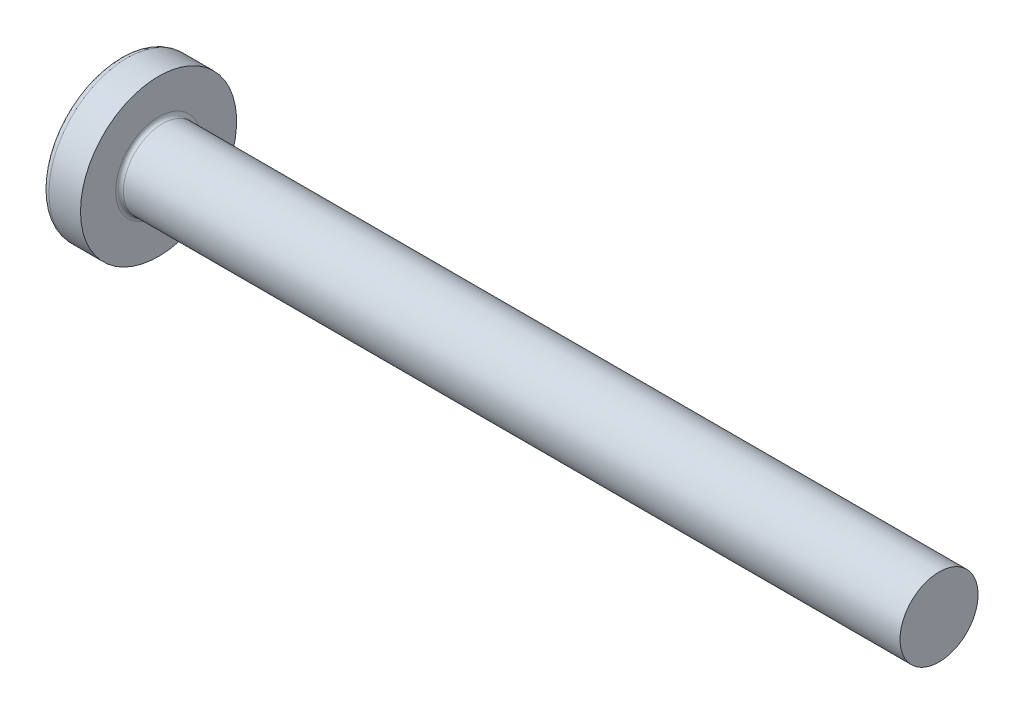
ISO-10303-21;
HEADER;
FILE_DESCRIPTION(('STEP AP214'),'2;1');
FILE_NAME('part.step','',(''),(''),'','','');
FILE_SCHEMA(('AUTOMOTIVE_DESIGN { 1 0 10303 214 1 1 1 1 }'));
ENDSEC;
DATA;
#1=APPLICATION_CONTEXT('core data for automotive mechanical design processes');
#2=APPLICATION_PROTOCOL_DEFINITION('international standard','automotive_design',2000,#1);
#3=PRODUCT_CONTEXT('',#1,'mechanical');
#4=PRODUCT('Part','Part','',(#3));
#5=PRODUCT_RELATED_PRODUCT_CATEGORY('part','',(#4));
#6=PRODUCT_DEFINITION_FORMATION('','',#4);
#7=PRODUCT_DEFINITION_CONTEXT('part definition',#1,'design');
#8=PRODUCT_DEFINITION('design','',#6,#7);
#9=PRODUCT_DEFINITION_SHAPE('','',#8);
#10=(LENGTH_UNIT() NAMED_UNIT(*) SI_UNIT(.MILLI.,.METRE.));
#11=(NAMED_UNIT(*) PLANE_ANGLE_UNIT() SI_UNIT($,.RADIAN.));
#12=(NAMED_UNIT(*) SI_UNIT($,.STERADIAN.) SOLID_ANGLE_UNIT());
#13=UNCERTAINTY_MEASURE_WITH_UNIT(LENGTH_MEASURE(1.E-05),#10,'distance_accuracy_value','');
#14=(GEOMETRIC_REPRESENTATION_CONTEXT(3) GLOBAL_UNCERTAINTY_ASSIGNED_CONTEXT((#13)) GLOBAL_UNIT_ASSIGNED_CONTEXT((#10,
#11,#12)) REPRESENTATION_CONTEXT('',''));
#15=CARTESIAN_POINT('',(0.,0.,0.));
#16=DIRECTION('',(0.,0.,1.));
#17=DIRECTION('',(1.,0.,0.));
#18=AXIS2_PLACEMENT_3D('',#15,#16,#17);
#19=CARTESIAN_POINT('',(3.2,0.,0.));
#20=DIRECTION('',(-1.,0.,0.));
#21=DIRECTION('',(0.,1.,0.));
#22=AXIS2_PLACEMENT_3D('',#19,#20,#21);
#23=SPHERICAL_SURFACE('',#22,3.2);
#24=CARTESIAN_POINT('',(0.646379599446113,0.,0.));
#25=DIRECTION('',(-1.,0.,0.));
#26=DIRECTION('',(0.,0.,1.));
#27=AXIS2_PLACEMENT_3D('',#24,#25,#26);
#28=CIRCLE('',#27,1.92847682119205);
#29=CARTESIAN_POINT('',(0.646379599446113,0.,1.92847682119205));
#30=VERTEX_POINT('',#29);
#31=EDGE_CURVE('E237',#30,#30,#28,.T.);
#32=ORIENTED_EDGE('',*,*,#31,.T.);
#33=EDGE_LOOP('',(#32));
#34=FACE_BOUND('',#33,.T.);
#35=CARTESIAN_POINT('',(0.0321614467928854,0.,0.));
#36=DIRECTION('',(1.,0.,0.));
#37=DIRECTION('',(0.,0.,-1.));
#38=AXIS2_PLACEMENT_3D('',#35,#36,#37);
#39=CIRCLE('',#38,0.452547125518057);
#40=CARTESIAN_POINT('',(0.0321614467928861,-0.239999999999998,-0.38366508938742));
#41=VERTEX_POINT('',#40);
#42=CARTESIAN_POINT('',(0.0321614467928854,-0.383665089387419,-0.24));
#43=VERTEX_POINT('',#42);
#44=EDGE_CURVE('E373',#41,#43,#39,.F.);
#45=ORIENTED_EDGE('',*,*,#44,.F.);
#46=CARTESIAN_POINT('',(3.2,-0.24,0.));
#47=DIRECTION('',(0.,1.,0.));
#48=DIRECTION('',(0.,0.,1.));
#49=AXIS2_PLACEMENT_3D('',#46,#47,#48);
#50=CIRCLE('',#49,3.19098730802866);
#51=CARTESIAN_POINT('',(0.160076673366103,-0.239999999999996,-0.970188728128244));
#52=VERTEX_POINT('',#51);
#53=EDGE_CURVE('E299',#52,#41,#50,.T.);
#54=ORIENTED_EDGE('',*,*,#53,.F.);
#55=CARTESIAN_POINT('',(2.98218780828175,0.,0.436863744320002));
#56=DIRECTION('',(0.446197753347436,0.,-0.894934391398443));
#57=DIRECTION('',(-0.894934391398442,0.,-0.446197753347436));
#58=AXIS2_PLACEMENT_3D('',#55,#56,#57);
#59=CIRCLE('',#58,3.16254769419176);
#60=CARTESIAN_POINT('',(0.160076673366103,0.240000000000003,-0.970188728128242));
#61=VERTEX_POINT('',#60);
#62=EDGE_CURVE('E271',#52,#61,#59,.T.);
#63=ORIENTED_EDGE('',*,*,#62,.T.);
#64=CARTESIAN_POINT('',(3.2,0.24,0.));
#65=DIRECTION('',(0.,-1.,0.));
#66=DIRECTION('',(0.,0.,-1.));
#67=AXIS2_PLACEMENT_3D('',#64,#65,#66);
#68=CIRCLE('',#67,3.19098730802866);
#69=CARTESIAN_POINT('',(0.0321614467928856,0.240000000000001,-0.383665089387418));
#70=VERTEX_POINT('',#69);
#71=EDGE_CURVE('E326',#70,#61,#68,.T.);
#72=ORIENTED_EDGE('',*,*,#71,.F.);
#73=CARTESIAN_POINT('',(0.0321614467928854,0.383665089387417,-0.24));
#74=VERTEX_POINT('',#73);
#75=EDGE_CURVE('E392',#74,#70,#39,.F.);
#76=ORIENTED_EDGE('',*,*,#75,.F.);
#77=CARTESIAN_POINT('',(3.2,0.,-0.24));
#78=DIRECTION('',(0.,0.,1.));
#79=DIRECTION('',(1.,0.,0.));
#80=AXIS2_PLACEMENT_3D('',#77,#78,#79);
#81=CIRCLE('',#80,3.19098730802866);
#82=CARTESIAN_POINT('',(0.160076673366104,0.970188728128243,-0.24));
#83=VERTEX_POINT('',#82);
#84=EDGE_CURVE('E265',#83,#74,#81,.T.);
#85=ORIENTED_EDGE('',*,*,#84,.F.);
#86=CARTESIAN_POINT('',(2.98218780828175,-0.436863744320003,0.));
#87=DIRECTION('',(0.446197753347436,0.894934391398443,0.));
#88=DIRECTION('',(-0.894934391398443,0.446197753347436,0.));
#89=AXIS2_PLACEMENT_3D('',#86,#87,#88);
#90=CIRCLE('',#89,3.16254769419176);
#91=CARTESIAN_POINT('',(0.160076673366104,0.970188728128243,0.24));
#92=VERTEX_POINT('',#91);
#93=EDGE_CURVE('E268',#83,#92,#90,.T.);
#94=ORIENTED_EDGE('',*,*,#93,.T.);
#95=CARTESIAN_POINT('',(3.2,0.,0.24));
#96=DIRECTION('',(0.,0.,-1.));
#97=DIRECTION('',(0.,1.,0.));
#98=AXIS2_PLACEMENT_3D('',#95,#96,#97);
#99=CIRCLE('',#98,3.19098730802866);
#100=CARTESIAN_POINT('',(0.0321614467928856,0.383665089387416,0.24));
#101=VERTEX_POINT('',#100);
#102=EDGE_CURVE('E261',#101,#92,#99,.T.);
#103=ORIENTED_EDGE('',*,*,#102,.F.);
#104=CARTESIAN_POINT('',(0.0321614467928855,0.239999999999999,0.38366508938742));
#105=VERTEX_POINT('',#104);
#106=EDGE_CURVE('E391',#105,#101,#39,.F.);
#107=ORIENTED_EDGE('',*,*,#106,.F.);
#108=CARTESIAN_POINT('',(0.160076673366103,0.239999999999997,0.970188728128244));
#109=VERTEX_POINT('',#108);
#110=EDGE_CURVE('E281',#109,#105,#68,.T.);
#111=ORIENTED_EDGE('',*,*,#110,.F.);
#112=CARTESIAN_POINT('',(2.98218780828175,0.,-0.436863744320003));
#113=DIRECTION('',(0.446197753347436,0.,0.894934391398443));
#114=DIRECTION('',(0.894934391398443,0.,-0.446197753347436));
#115=AXIS2_PLACEMENT_3D('',#112,#113,#114);
#116=CIRCLE('',#115,3.16254769419176);
#117=CARTESIAN_POINT('',(0.160076673366103,-0.240000000000003,0.970188728128242));
#118=VERTEX_POINT('',#117);
#119=EDGE_CURVE('E48',#109,#118,#116,.T.);
#120=ORIENTED_EDGE('',*,*,#119,.T.);
#121=CARTESIAN_POINT('',(0.0321614467928861,-0.240000000000001,0.383665089387418));
#122=VERTEX_POINT('',#121);
#123=EDGE_CURVE('E278',#122,#118,#50,.T.);
#124=ORIENTED_EDGE('',*,*,#123,.F.);
#125=CARTESIAN_POINT('',(0.0321614467928856,-0.383665089387418,0.24));
#126=VERTEX_POINT('',#125);
#127=EDGE_CURVE('E427',#126,#122,#39,.F.);
#128=ORIENTED_EDGE('',*,*,#127,.F.);
#129=CARTESIAN_POINT('',(0.160076673366103,-0.970188728128243,0.24));
#130=VERTEX_POINT('',#129);
#131=EDGE_CURVE('E262',#130,#126,#99,.T.);
#132=ORIENTED_EDGE('',*,*,#131,.F.);
#133=CARTESIAN_POINT('',(2.98218780828175,0.436863744320002,0.));
#134=DIRECTION('',(0.446197753347436,-0.894934391398443,0.));
#135=DIRECTION('',(0.894934391398442,0.446197753347436,0.));
#136=AXIS2_PLACEMENT_3D('',#133,#134,#135);
#137=CIRCLE('',#136,3.16254769419176);
#138=CARTESIAN_POINT('',(0.160076673366103,-0.970188728128243,-0.24));
#139=VERTEX_POINT('',#138);
#140=EDGE_CURVE('E258',#130,#139,#137,.T.);
#141=ORIENTED_EDGE('',*,*,#140,.T.);
#142=EDGE_CURVE('E63',#43,#139,#81,.T.);
#143=ORIENTED_EDGE('',*,*,#142,.F.);
#144=EDGE_LOOP('',(#45,#54,#63,#72,#76,#85,#94,#103,#107,#111,#120,#124,#128,#132,#141,#143));
#145=FACE_BOUND('',#144,.T.);
#146=ADVANCED_FACE('F35',(#34,#145),#23,.T.);
#147=CARTESIAN_POINT('',(1.42,0.342014234961647,-0.24));
#148=DIRECTION('',(0.,0.,1.));
#149=DIRECTION('',(1.,0.,0.));
#150=AXIS2_PLACEMENT_3D('',#147,#148,#149);
#151=PLANE('',#150);
#152=ORIENTED_EDGE('',*,*,#84,.T.);
#153=CARTESIAN_POINT('',(-0.626811087646333,0.437068483432734,-0.24));
#154=CARTESIAN_POINT('',(-0.489788496188268,0.426133650699674,-0.24));
#155=CARTESIAN_POINT('',(-0.35277275089666,0.415111501640761,-0.24));
#156=CARTESIAN_POINT('',(-0.078757882964478,0.392826208775377,-0.24));
#157=CARTESIAN_POINT('',(0.0582412392502161,0.381563059737591,-0.24));
#158=CARTESIAN_POINT('',(0.332213907654152,0.358729879929546,-0.24));
#159=CARTESIAN_POINT('',(0.469187453856035,0.347159849311357,-0.24));
#160=CARTESIAN_POINT('',(0.743097225439297,0.323608060039765,-0.24));
#161=CARTESIAN_POINT('',(0.880033451350377,0.311626307573655,-0.24));
#162=CARTESIAN_POINT('',(1.12503843743479,0.289667437089413,-0.24));
#163=CARTESIAN_POINT('',(1.23311691792,0.279799173776849,-0.24));
#164=CARTESIAN_POINT('',(1.4492267018282,0.259570129968442,-0.24));
#165=CARTESIAN_POINT('',(1.55725800577256,0.249209355061897,-0.24));
#166=CARTESIAN_POINT('',(1.77325939831777,0.227783788850472,-0.24));
#167=CARTESIAN_POINT('',(1.88122948205844,0.216718947894399,-0.24));
#168=CARTESIAN_POINT('',(2.04309848476113,0.199296215271932,-0.24));
#169=CARTESIAN_POINT('',(2.09704158415864,0.193350927204474,-0.24));
#170=CARTESIAN_POINT('',(2.20488609252136,0.181086542764125,-0.24));
#171=CARTESIAN_POINT('',(2.25878750075649,0.174767439988846,-0.24));
#172=CARTESIAN_POINT('',(2.31266102213859,0.168212174791089,-0.24));
#173=B_SPLINE_CURVE_WITH_KNOTS('',3,(#153,#154,#155,#156,#157,#158,#159,#160,#161,#162,#163,
#164,#165,#166,#167,#168,#169,#170,#171,#172),.UNSPECIFIED.,.F.,.F.,(4,2,2,2,2,2,2,2,2,4),(0.,
0.412374804430943,0.824758569256476,1.23714212973639,1.64951949568622,1.97510284899868,
2.30068250829037,2.62628515317116,2.78909323564388,2.95190410736571),.UNSPECIFIED.);
#174=CARTESIAN_POINT('',(1.42,0.262259890185288,-0.240000000000001));
#175=VERTEX_POINT('',#174);
#176=EDGE_CURVE('E413',#74,#175,#173,.T.);
#177=ORIENTED_EDGE('',*,*,#176,.T.);
#178=DIRECTION('',(0.,1.,0.));
#179=VECTOR('',#178,1.);
#180=CARTESIAN_POINT('',(1.42,-0.342014234961648,-0.24));
#181=LINE('',#180,#179);
#182=CARTESIAN_POINT('',(1.42,0.342014234961647,-0.24));
#183=VERTEX_POINT('',#182);
#184=EDGE_CURVE('E355',#175,#183,#181,.T.);
#185=ORIENTED_EDGE('',*,*,#184,.T.);
#186=DIRECTION('',(0.894934391398442,-0.446197753347436,0.));
#187=VECTOR('',#186,1.);
#188=CARTESIAN_POINT('',(0.,1.05,-0.24));
#189=LINE('',#188,#187);
#190=EDGE_CURVE('E238',#83,#183,#189,.T.);
#191=ORIENTED_EDGE('',*,*,#190,.F.);
#192=EDGE_LOOP('',(#152,#177,#185,#191));
#193=FACE_BOUND('',#192,.T.);
#194=ADVANCED_FACE('F193',(#193),#151,.T.);
#195=CARTESIAN_POINT('',(1.42,-0.342014234961648,-0.24));
#196=VERTEX_POINT('',#195);
#197=CARTESIAN_POINT('',(1.42,-0.262259890185288,-0.240000000000001));
#198=VERTEX_POINT('',#197);
#199=EDGE_CURVE('E246',#196,#198,#181,.T.);
#200=ORIENTED_EDGE('',*,*,#199,.T.);
#201=CARTESIAN_POINT('',(-0.626811087646333,-0.437068483432734,-0.24));
#202=CARTESIAN_POINT('',(-0.489788496188268,-0.426133650699674,-0.24));
#203=CARTESIAN_POINT('',(-0.35277275089666,-0.415111501640761,-0.24));
#204=CARTESIAN_POINT('',(-0.078757882964478,-0.392826208775377,-0.24));
#205=CARTESIAN_POINT('',(0.0582412392502161,-0.381563059737591,-0.24));
#206=CARTESIAN_POINT('',(0.332213907654152,-0.358729879929546,-0.24));
#207=CARTESIAN_POINT('',(0.469187453856035,-0.347159849311357,-0.24));
#208=CARTESIAN_POINT('',(0.743097225439297,-0.323608060039765,-0.24));
#209=CARTESIAN_POINT('',(0.880033451350377,-0.311626307573655,-0.24));
#210=CARTESIAN_POINT('',(1.12503843743479,-0.289667437089413,-0.24));
#211=CARTESIAN_POINT('',(1.23311691792,-0.279799173776849,-0.24));
#212=CARTESIAN_POINT('',(1.4492267018282,-0.259570129968442,-0.24));
#213=CARTESIAN_POINT('',(1.55725800577256,-0.249209355061897,-0.24));
#214=CARTESIAN_POINT('',(1.77325939831777,-0.227783788850472,-0.24));
#215=CARTESIAN_POINT('',(1.88122948205844,-0.216718947894399,-0.24));
#216=CARTESIAN_POINT('',(2.04309848476113,-0.199296215271932,-0.24));
#217=CARTESIAN_POINT('',(2.09704158415864,-0.193350927204474,-0.24));
#218=CARTESIAN_POINT('',(2.20488609252136,-0.181086542764125,-0.24));
#219=CARTESIAN_POINT('',(2.25878750075649,-0.174767439988846,-0.24));
#220=CARTESIAN_POINT('',(2.31266102213859,-0.168212174791089,-0.24));
#221=B_SPLINE_CURVE_WITH_KNOTS('',3,(#201,#202,#203,#204,#205,#206,#207,#208,#209,#210,#211,
#212,#213,#214,#215,#216,#217,#218,#219,#220),.UNSPECIFIED.,.F.,.F.,(4,2,2,2,2,2,2,2,2,4),(0.,
0.412374804430943,0.824758569256476,1.23714212973639,1.64951949568622,1.97510284899868,
2.30068250829037,2.62628515317116,2.78909323564388,2.95190410736571),.UNSPECIFIED.);
#222=EDGE_CURVE('E390',#198,#43,#221,.F.);
#223=ORIENTED_EDGE('',*,*,#222,.T.);
#224=ORIENTED_EDGE('',*,*,#142,.T.);
#225=DIRECTION('',(0.894934391398442,0.446197753347436,0.));
#226=VECTOR('',#225,1.);
#227=CARTESIAN_POINT('',(0.,-1.05,-0.24));
#228=LINE('',#227,#226);
#229=EDGE_CURVE('E329',#139,#196,#228,.T.);
#230=ORIENTED_EDGE('',*,*,#229,.T.);
#231=EDGE_LOOP('',(#200,#223,#224,#230));
#232=FACE_BOUND('',#231,.T.);
#233=ADVANCED_FACE('F199',(#232),#151,.T.);
#234=CARTESIAN_POINT('',(1.42,-0.342014234961647,0.24));
#235=DIRECTION('',(0.,0.,-1.));
#236=DIRECTION('',(0.,1.,0.));
#237=AXIS2_PLACEMENT_3D('',#234,#235,#236);
#238=PLANE('',#237);
#239=DIRECTION('',(0.,-1.,0.));
#240=VECTOR('',#239,1.);
#241=CARTESIAN_POINT('',(1.42,0.342014234961647,0.24));
#242=LINE('',#241,#240);
#243=CARTESIAN_POINT('',(1.42,0.342014234961647,0.24));
#244=VERTEX_POINT('',#243);
#245=CARTESIAN_POINT('',(1.42,0.262259890185288,0.240000000000001));
#246=VERTEX_POINT('',#245);
#247=EDGE_CURVE('E338',#244,#246,#242,.T.);
#248=ORIENTED_EDGE('',*,*,#247,.T.);
#249=CARTESIAN_POINT('',(-0.62681108769363,0.437068483436507,0.24));
#250=CARTESIAN_POINT('',(-0.489788496230297,0.426133650703048,0.24));
#251=CARTESIAN_POINT('',(-0.352772750933422,0.415111501643733,0.24));
#252=CARTESIAN_POINT('',(-0.0787578829907056,0.392826208777529,0.24));
#253=CARTESIAN_POINT('',(0.0582412392292552,0.381563059739326,0.24));
#254=CARTESIAN_POINT('',(0.332213907649304,0.358729879929962,0.24));
#255=CARTESIAN_POINT('',(0.46918745386203,0.347159849310859,0.24));
#256=CARTESIAN_POINT('',(0.743097225466975,0.323608060037368,0.24));
#257=CARTESIAN_POINT('',(0.880033451388893,0.311626307570274,0.24));
#258=CARTESIAN_POINT('',(1.12503843748414,0.289667437084935,0.24));
#259=CARTESIAN_POINT('',(1.23311691796934,0.279799173772307,0.24));
#260=CARTESIAN_POINT('',(1.44922670187753,0.259570129963748,0.24));
#261=CARTESIAN_POINT('',(1.55725800582188,0.249209355057115,0.24));
#262=CARTESIAN_POINT('',(1.77325939836707,0.227783788845471,0.24));
#263=CARTESIAN_POINT('',(1.88122948210773,0.216718947889267,0.24));
#264=CARTESIAN_POINT('',(2.0430984848104,0.199296215266543,0.24));
#265=CARTESIAN_POINT('',(2.0970415842079,0.193350927198989,0.24));
#266=CARTESIAN_POINT('',(2.20488609257059,0.181086542758413,0.24));
#267=CARTESIAN_POINT('',(2.25878750080571,0.174767439983005,0.24));
#268=CARTESIAN_POINT('',(2.31266102218779,0.168212174785094,0.24));
#269=B_SPLINE_CURVE_WITH_KNOTS('',3,(#249,#250,#251,#252,#253,#254,#255,#256,#257,#258,#259,
#260,#261,#262,#263,#264,#265,#266,#267,#268),.UNSPECIFIED.,.F.,.F.,(4,2,2,2,2,2,2,2,2,4),(0.,
0.412374804446791,0.824758569288173,1.23714212980074,1.64951949578321,1.97510284909568,
2.30068250838736,2.62628515326816,2.78909323574088,2.95190410746272),.UNSPECIFIED.);
#270=EDGE_CURVE('E665',#246,#101,#269,.F.);
#271=ORIENTED_EDGE('',*,*,#270,.T.);
#272=ORIENTED_EDGE('',*,*,#102,.T.);
#273=DIRECTION('',(0.894934391398442,-0.446197753347436,0.));
#274=VECTOR('',#273,1.);
#275=CARTESIAN_POINT('',(0.,1.05,0.24));
#276=LINE('',#275,#274);
#277=EDGE_CURVE('E243',#92,#244,#276,.T.);
#278=ORIENTED_EDGE('',*,*,#277,.T.);
#279=EDGE_LOOP('',(#248,#271,#272,#278));
#280=FACE_BOUND('',#279,.T.);
#281=ADVANCED_FACE('F409',(#280),#238,.T.);
#282=ORIENTED_EDGE('',*,*,#131,.T.);
#283=CARTESIAN_POINT('',(-0.62681108769363,-0.437068483436507,0.24));
#284=CARTESIAN_POINT('',(-0.489788496230297,-0.426133650703048,0.24));
#285=CARTESIAN_POINT('',(-0.352772750933422,-0.415111501643733,0.24));
#286=CARTESIAN_POINT('',(-0.0787578829907059,-0.392826208777529,0.24));
#287=CARTESIAN_POINT('',(0.058241239229255,-0.381563059739326,0.24));
#288=CARTESIAN_POINT('',(0.332213907649304,-0.358729879929962,0.24));
#289=CARTESIAN_POINT('',(0.46918745386203,-0.347159849310859,0.24));
#290=CARTESIAN_POINT('',(0.743097225466975,-0.323608060037368,0.24));
#291=CARTESIAN_POINT('',(0.880033451388893,-0.311626307570274,0.24));
#292=CARTESIAN_POINT('',(1.12503843748414,-0.289667437084935,0.24));
#293=CARTESIAN_POINT('',(1.23311691796934,-0.279799173772307,0.24));
#294=CARTESIAN_POINT('',(1.44922670187753,-0.259570129963748,0.24));
#295=CARTESIAN_POINT('',(1.55725800582188,-0.249209355057115,0.24));
#296=CARTESIAN_POINT('',(1.77325939836707,-0.227783788845471,0.24));
#297=CARTESIAN_POINT('',(1.88122948210773,-0.216718947889267,0.24));
#298=CARTESIAN_POINT('',(2.0430984848104,-0.199296215266543,0.24));
#299=CARTESIAN_POINT('',(2.0970415842079,-0.193350927198989,0.24));
#300=CARTESIAN_POINT('',(2.20488609257059,-0.181086542758413,0.24));
#301=CARTESIAN_POINT('',(2.25878750080571,-0.174767439983005,0.24));
#302=CARTESIAN_POINT('',(2.31266102218779,-0.168212174785094,0.24));
#303=B_SPLINE_CURVE_WITH_KNOTS('',3,(#283,#284,#285,#286,#287,#288,#289,#290,#291,#292,#293,
#294,#295,#296,#297,#298,#299,#300,#301,#302),.UNSPECIFIED.,.F.,.F.,(4,2,2,2,2,2,2,2,2,4),(0.,
0.412374804446791,0.824758569288173,1.23714212980074,1.64951949578321,1.97510284909568,
2.30068250838736,2.62628515326816,2.78909323574088,2.95190410746272),.UNSPECIFIED.);
#304=CARTESIAN_POINT('',(1.42,-0.262259890185289,0.240000000000001));
#305=VERTEX_POINT('',#304);
#306=EDGE_CURVE('E428',#126,#305,#303,.T.);
#307=ORIENTED_EDGE('',*,*,#306,.T.);
#308=CARTESIAN_POINT('',(1.42,-0.342014234961648,0.24));
#309=VERTEX_POINT('',#308);
#310=EDGE_CURVE('E340',#305,#309,#242,.T.);
#311=ORIENTED_EDGE('',*,*,#310,.T.);
#312=DIRECTION('',(0.894934391398442,0.446197753347436,0.));
#313=VECTOR('',#312,1.);
#314=CARTESIAN_POINT('',(0.,-1.05,0.24));
#315=LINE('',#314,#313);
#316=EDGE_CURVE('E331',#130,#309,#315,.T.);
#317=ORIENTED_EDGE('',*,*,#316,.F.);
#318=EDGE_LOOP('',(#282,#307,#311,#317));
#319=FACE_BOUND('',#318,.T.);
#320=ADVANCED_FACE('F513',(#319),#238,.T.);
#321=CARTESIAN_POINT('',(0.,1.05,0.24));
#322=DIRECTION('',(0.446197753347436,0.894934391398443,0.));
#323=DIRECTION('',(-0.894934391398443,0.446197753347436,0.));
#324=AXIS2_PLACEMENT_3D('',#321,#322,#323);
#325=PLANE('',#324);
#326=CARTESIAN_POINT('',(2.01772965253961,0.0439972734550525,0.));
#327=DIRECTION('',(0.446197753347436,0.894934391398443,0.));
#328=DIRECTION('',(-0.894934391398443,0.446197753347436,0.));
#329=AXIS2_PLACEMENT_3D('',#326,#327,#328);
#330=ELLIPSE('',#329,0.703057486597294,0.310602005333466);
#331=CARTESIAN_POINT('',(1.42,0.342014234961648,0.0969871799961127));
#332=VERTEX_POINT('',#331);
#333=CARTESIAN_POINT('',(1.42,0.342014234961648,-0.0969871799961128));
#334=VERTEX_POINT('',#333);
#335=EDGE_CURVE('E304',#332,#334,#330,.F.);
#336=ORIENTED_EDGE('',*,*,#335,.F.);
#337=DIRECTION('',(0.,0.,-1.));
#338=VECTOR('',#337,1.);
#339=CARTESIAN_POINT('',(1.42,0.342014234961647,0.24));
#340=LINE('',#339,#338);
#341=EDGE_CURVE('E341',#244,#332,#340,.T.);
#342=ORIENTED_EDGE('',*,*,#341,.F.);
#343=ORIENTED_EDGE('',*,*,#277,.F.);
#344=ORIENTED_EDGE('',*,*,#93,.F.);
#345=ORIENTED_EDGE('',*,*,#190,.T.);
#346=EDGE_CURVE('E343',#334,#183,#340,.T.);
#347=ORIENTED_EDGE('',*,*,#346,.F.);
#348=EDGE_LOOP('',(#336,#342,#343,#344,#345,#347));
#349=FACE_BOUND('',#348,.T.);
#350=ADVANCED_FACE('F407',(#349),#325,.F.);
#351=CARTESIAN_POINT('',(0.,-1.05,-0.24));
#352=DIRECTION('',(0.446197753347436,-0.894934391398443,0.));
#353=DIRECTION('',(0.894934391398442,0.446197753347436,0.));
#354=AXIS2_PLACEMENT_3D('',#351,#352,#353);
#355=PLANE('',#354);
#356=CARTESIAN_POINT('',(2.01772965253961,-0.0439972734550525,0.));
#357=DIRECTION('',(0.446197753347436,-0.894934391398443,0.));
#358=DIRECTION('',(-0.894934391398443,-0.446197753347436,0.));
#359=AXIS2_PLACEMENT_3D('',#356,#357,#358);
#360=ELLIPSE('',#359,0.703057486597294,0.310602005333466);
#361=CARTESIAN_POINT('',(1.42,-0.342014234961649,-0.0969871799961111));
#362=VERTEX_POINT('',#361);
#363=CARTESIAN_POINT('',(1.42,-0.342014234961649,0.096987179996111));
#364=VERTEX_POINT('',#363);
#365=EDGE_CURVE('E667',#362,#364,#360,.F.);
#366=ORIENTED_EDGE('',*,*,#365,.F.);
#367=DIRECTION('',(0.,0.,1.));
#368=VECTOR('',#367,1.);
#369=CARTESIAN_POINT('',(1.42,-0.342014234961648,-0.24));
#370=LINE('',#369,#368);
#371=EDGE_CURVE('E334',#196,#362,#370,.T.);
#372=ORIENTED_EDGE('',*,*,#371,.F.);
#373=ORIENTED_EDGE('',*,*,#229,.F.);
#374=ORIENTED_EDGE('',*,*,#140,.F.);
#375=ORIENTED_EDGE('',*,*,#316,.T.);
#376=EDGE_CURVE('E337',#364,#309,#370,.T.);
#377=ORIENTED_EDGE('',*,*,#376,.F.);
#378=EDGE_LOOP('',(#366,#372,#373,#374,#375,#377));
#379=FACE_BOUND('',#378,.T.);
#380=ADVANCED_FACE('F500',(#379),#355,.F.);
#381=CARTESIAN_POINT('',(1.42,0.342014234961647,-0.24));
#382=DIRECTION('',(-1.,0.,0.));
#383=DIRECTION('',(0.,0.,1.));
#384=AXIS2_PLACEMENT_3D('',#381,#382,#383);
#385=PLANE('',#384);
#386=DIRECTION('',(0.,1.,0.));
#387=VECTOR('',#386,1.);
#388=CARTESIAN_POINT('',(1.42,-0.240000000000001,0.342014234961646));
#389=LINE('',#388,#387);
#390=CARTESIAN_POINT('',(1.42,-0.240000000000001,0.342014234961646));
#391=VERTEX_POINT('',#390);
#392=CARTESIAN_POINT('',(1.42,-0.096987179996118,0.342014234961647));
#393=VERTEX_POINT('',#392);
#394=EDGE_CURVE('E319',#391,#393,#389,.T.);
#395=ORIENTED_EDGE('',*,*,#394,.T.);
#396=CARTESIAN_POINT('',(1.42,0.,0.));
#397=DIRECTION('',(-1.,0.,0.));
#398=DIRECTION('',(0.,0.,1.));
#399=AXIS2_PLACEMENT_3D('',#396,#397,#398);
#400=CIRCLE('',#399,0.3555);
#401=CARTESIAN_POINT('',(1.42,-0.240000000000001,0.262259890185288));
#402=VERTEX_POINT('',#401);
#403=EDGE_CURVE('E693',#402,#393,#400,.T.);
#404=ORIENTED_EDGE('',*,*,#403,.F.);
#405=DIRECTION('',(0.,0.,-1.));
#406=VECTOR('',#405,1.);
#407=CARTESIAN_POINT('',(1.42,-0.240000000000001,0.342014234961646));
#408=LINE('',#407,#406);
#409=EDGE_CURVE('E315',#391,#402,#408,.T.);
#410=ORIENTED_EDGE('',*,*,#409,.F.);
#411=EDGE_LOOP('',(#395,#404,#410));
#412=FACE_BOUND('',#411,.T.);
#413=ADVANCED_FACE('F493',(#412),#385,.T.);
#414=ORIENTED_EDGE('',*,*,#310,.F.);
#415=EDGE_CURVE('E698',#364,#305,#400,.T.);
#416=ORIENTED_EDGE('',*,*,#415,.F.);
#417=ORIENTED_EDGE('',*,*,#376,.T.);
#418=EDGE_LOOP('',(#414,#416,#417));
#419=FACE_BOUND('',#418,.T.);
#420=ADVANCED_FACE('F486',(#419),#385,.T.);
#421=ORIENTED_EDGE('',*,*,#371,.T.);
#422=EDGE_CURVE('E384',#198,#362,#400,.T.);
#423=ORIENTED_EDGE('',*,*,#422,.F.);
#424=ORIENTED_EDGE('',*,*,#199,.F.);
#425=EDGE_LOOP('',(#421,#423,#424));
#426=FACE_BOUND('',#425,.T.);
#427=ADVANCED_FACE('F480',(#426),#385,.T.);
#428=CARTESIAN_POINT('',(1.42,-0.239999999999999,-0.262259890185288));
#429=VERTEX_POINT('',#428);
#430=CARTESIAN_POINT('',(1.42,-0.239999999999999,-0.342014234961648));
#431=VERTEX_POINT('',#430);
#432=EDGE_CURVE('E318',#429,#431,#408,.T.);
#433=ORIENTED_EDGE('',*,*,#432,.F.);
#434=CARTESIAN_POINT('',(1.42,-0.0969871799961141,-0.342014234961648));
#435=VERTEX_POINT('',#434);
#436=EDGE_CURVE('E55',#435,#429,#400,.T.);
#437=ORIENTED_EDGE('',*,*,#436,.F.);
#438=DIRECTION('',(0.,-1.,0.));
#439=VECTOR('',#438,1.);
#440=CARTESIAN_POINT('',(1.42,0.240000000000001,-0.342014234961647));
#441=LINE('',#440,#439);
#442=EDGE_CURVE('E314',#435,#431,#441,.T.);
#443=ORIENTED_EDGE('',*,*,#442,.T.);
#444=EDGE_LOOP('',(#433,#437,#443));
#445=FACE_BOUND('',#444,.T.);
#446=ADVANCED_FACE('F379',(#445),#385,.T.);
#447=CARTESIAN_POINT('',(1.42,0.240000000000001,-0.342014234961647));
#448=VERTEX_POINT('',#447);
#449=CARTESIAN_POINT('',(1.42,0.0969871799961165,-0.342014234961647));
#450=VERTEX_POINT('',#449);
#451=EDGE_CURVE('E311',#448,#450,#441,.T.);
#452=ORIENTED_EDGE('',*,*,#451,.T.);
#453=CARTESIAN_POINT('',(1.42,0.240000000000001,-0.262259890185288));
#454=VERTEX_POINT('',#453);
#455=EDGE_CURVE('E383',#454,#450,#400,.T.);
#456=ORIENTED_EDGE('',*,*,#455,.F.);
#457=DIRECTION('',(0.,0.,1.));
#458=VECTOR('',#457,1.);
#459=CARTESIAN_POINT('',(1.42,0.240000000000001,-0.342014234961647));
#460=LINE('',#459,#458);
#461=EDGE_CURVE('E323',#448,#454,#460,.T.);
#462=ORIENTED_EDGE('',*,*,#461,.F.);
#463=EDGE_LOOP('',(#452,#456,#462));
#464=FACE_BOUND('',#463,.T.);
#465=ADVANCED_FACE('F468',(#464),#385,.T.);
#466=ORIENTED_EDGE('',*,*,#184,.F.);
#467=EDGE_CURVE('E682',#334,#175,#400,.T.);
#468=ORIENTED_EDGE('',*,*,#467,.F.);
#469=ORIENTED_EDGE('',*,*,#346,.T.);
#470=EDGE_LOOP('',(#466,#468,#469));
#471=FACE_BOUND('',#470,.T.);
#472=ADVANCED_FACE('F461',(#471),#385,.T.);
#473=ORIENTED_EDGE('',*,*,#341,.T.);
#474=EDGE_CURVE('E684',#246,#332,#400,.T.);
#475=ORIENTED_EDGE('',*,*,#474,.F.);
#476=ORIENTED_EDGE('',*,*,#247,.F.);
#477=EDGE_LOOP('',(#473,#475,#476));
#478=FACE_BOUND('',#477,.T.);
#479=ADVANCED_FACE('F455',(#478),#385,.T.);
#480=CARTESIAN_POINT('',(1.42,0.239999999999999,0.342014234961648));
#481=DIRECTION('',(0.,-1.,0.));
#482=DIRECTION('',(1.,0.,0.));
#483=AXIS2_PLACEMENT_3D('',#480,#481,#482);
#484=PLANE('',#483);
#485=ORIENTED_EDGE('',*,*,#110,.T.);
#486=CARTESIAN_POINT('',(-0.626811087646333,0.239999999999998,0.437068483432735));
#487=CARTESIAN_POINT('',(-0.489788496188268,0.239999999999999,0.426133650699675));
#488=CARTESIAN_POINT('',(-0.35277275089666,0.239999999999999,0.415111501640762));
#489=CARTESIAN_POINT('',(-0.078757882964478,0.239999999999999,0.392826208775378));
#490=CARTESIAN_POINT('',(0.0582412392502161,0.239999999999999,0.381563059737592));
#491=CARTESIAN_POINT('',(0.332213907654152,0.239999999999999,0.358729879929547));
#492=CARTESIAN_POINT('',(0.469187453856035,0.239999999999999,0.347159849311358));
#493=CARTESIAN_POINT('',(0.743097225439297,0.239999999999999,0.323608060039766));
#494=CARTESIAN_POINT('',(0.880033451350377,0.239999999999999,0.311626307573656));
#495=CARTESIAN_POINT('',(1.12503843743479,0.239999999999999,0.289667437089414));
#496=CARTESIAN_POINT('',(1.23311691792,0.239999999999999,0.279799173776849));
#497=CARTESIAN_POINT('',(1.4492267018282,0.239999999999999,0.259570129968442));
#498=CARTESIAN_POINT('',(1.55725800577256,0.239999999999999,0.249209355061898));
#499=CARTESIAN_POINT('',(1.77325939831777,0.239999999999999,0.227783788850473));
#500=CARTESIAN_POINT('',(1.88122948205844,0.239999999999999,0.216718947894399));
#501=CARTESIAN_POINT('',(2.04309848476113,0.239999999999999,0.199296215271933));
#502=CARTESIAN_POINT('',(2.09704158415864,0.239999999999999,0.193350927204475));
#503=CARTESIAN_POINT('',(2.20488609252136,0.239999999999999,0.181086542764126));
#504=CARTESIAN_POINT('',(2.25878750075649,0.239999999999999,0.174767439988847));
#505=CARTESIAN_POINT('',(2.31266102213859,0.239999999999999,0.16821217479109));
#506=B_SPLINE_CURVE_WITH_KNOTS('',3,(#486,#487,#488,#489,#490,#491,#492,#493,#494,#495,#496,
#497,#498,#499,#500,#501,#502,#503,#504,#505),.UNSPECIFIED.,.F.,.F.,(4,2,2,2,2,2,2,2,2,4),(0.,
0.412374804430943,0.824758569256476,1.23714212973639,1.64951949568622,1.97510284899868,
2.30068250829037,2.62628515317116,2.78909323564388,2.95190410736571),.UNSPECIFIED.);
#507=CARTESIAN_POINT('',(1.42,0.239999999999999,0.26225989018529));
#508=VERTEX_POINT('',#507);
#509=EDGE_CURVE('E664',#105,#508,#506,.T.);
#510=ORIENTED_EDGE('',*,*,#509,.T.);
#511=CARTESIAN_POINT('',(1.42,0.239999999999999,0.342014234961648));
#512=VERTEX_POINT('',#511);
#513=EDGE_CURVE('E296',#508,#512,#460,.T.);
#514=ORIENTED_EDGE('',*,*,#513,.T.);
#515=DIRECTION('',(0.894934391398442,0.,-0.446197753347436));
#516=VECTOR('',#515,1.);
#517=CARTESIAN_POINT('',(0.,0.239999999999996,1.05));
#518=LINE('',#517,#516);
#519=EDGE_CURVE('E289',#109,#512,#518,.T.);
#520=ORIENTED_EDGE('',*,*,#519,.F.);
#521=EDGE_LOOP('',(#485,#510,#514,#520));
#522=FACE_BOUND('',#521,.T.);
#523=ADVANCED_FACE('F293',(#522),#484,.T.);
#524=CARTESIAN_POINT('',(1.42,-0.239999999999999,-0.342014234961648));
#525=DIRECTION('',(0.,1.,0.));
#526=DIRECTION('',(0.,0.,1.));
#527=AXIS2_PLACEMENT_3D('',#524,#525,#526);
#528=PLANE('',#527);
#529=ORIENTED_EDGE('',*,*,#409,.T.);
#530=CARTESIAN_POINT('',(-0.62681108769363,-0.240000000000001,0.437068483436506));
#531=CARTESIAN_POINT('',(-0.489788496230297,-0.240000000000001,0.426133650703047));
#532=CARTESIAN_POINT('',(-0.352772750933422,-0.240000000000001,0.415111501643732));
#533=CARTESIAN_POINT('',(-0.0787578829907057,-0.240000000000001,0.392826208777528));
#534=CARTESIAN_POINT('',(0.0582412392292551,-0.240000000000001,0.381563059739325));
#535=CARTESIAN_POINT('',(0.332213907649304,-0.240000000000001,0.358729879929961));
#536=CARTESIAN_POINT('',(0.46918745386203,-0.240000000000001,0.347159849310858));
#537=CARTESIAN_POINT('',(0.743097225466975,-0.240000000000001,0.323608060037367));
#538=CARTESIAN_POINT('',(0.880033451388893,-0.240000000000001,0.311626307570273));
#539=CARTESIAN_POINT('',(1.12503843748414,-0.240000000000001,0.289667437084934));
#540=CARTESIAN_POINT('',(1.23311691796933,-0.240000000000001,0.279799173772306));
#541=CARTESIAN_POINT('',(1.44922670187753,-0.240000000000001,0.259570129963747));
#542=CARTESIAN_POINT('',(1.55725800582188,-0.240000000000001,0.249209355057114));
#543=CARTESIAN_POINT('',(1.77325939836707,-0.240000000000001,0.22778378884547));
#544=CARTESIAN_POINT('',(1.88122948210773,-0.240000000000001,0.216718947889266));
#545=CARTESIAN_POINT('',(2.0430984848104,-0.240000000000001,0.199296215266542));
#546=CARTESIAN_POINT('',(2.0970415842079,-0.240000000000001,0.193350927198988));
#547=CARTESIAN_POINT('',(2.20488609257059,-0.240000000000001,0.181086542758413));
#548=CARTESIAN_POINT('',(2.25878750080571,-0.240000000000001,0.174767439983004));
#549=CARTESIAN_POINT('',(2.31266102218779,-0.240000000000001,0.168212174785094));
#550=B_SPLINE_CURVE_WITH_KNOTS('',3,(#530,#531,#532,#533,#534,#535,#536,#537,#538,#539,#540,
#541,#542,#543,#544,#545,#546,#547,#548,#549),.UNSPECIFIED.,.F.,.F.,(4,2,2,2,2,2,2,2,2,4),(0.,
0.412374804446791,0.824758569288173,1.23714212980074,1.64951949578321,1.97510284909568,
2.30068250838736,2.62628515326816,2.78909323574088,2.95190410746272),.UNSPECIFIED.);
#551=EDGE_CURVE('E421',#402,#122,#550,.F.);
#552=ORIENTED_EDGE('',*,*,#551,.T.);
#553=ORIENTED_EDGE('',*,*,#123,.T.);
#554=DIRECTION('',(0.894934391398442,0.,-0.446197753347436));
#555=VECTOR('',#554,1.);
#556=CARTESIAN_POINT('',(0.,-0.240000000000004,1.05));
#557=LINE('',#556,#555);
#558=EDGE_CURVE('E291',#118,#391,#557,.T.);
#559=ORIENTED_EDGE('',*,*,#558,.T.);
#560=EDGE_LOOP('',(#529,#552,#553,#559));
#561=FACE_BOUND('',#560,.T.);
#562=ADVANCED_FACE('F228',(#561),#528,.T.);
#563=CARTESIAN_POINT('',(0.,-0.240000000000004,1.05));
#564=DIRECTION('',(0.446197753347436,0.,0.894934391398443));
#565=DIRECTION('',(-0.894934391398443,0.,0.446197753347436));
#566=AXIS2_PLACEMENT_3D('',#563,#564,#565);
#567=PLANE('',#566);
#568=CARTESIAN_POINT('',(2.01772965253961,0.,0.0439972734550526));
#569=DIRECTION('',(0.446197753347436,0.,0.894934391398443));
#570=DIRECTION('',(-0.894934391398443,0.,0.446197753347436));
#571=AXIS2_PLACEMENT_3D('',#568,#569,#570);
#572=ELLIPSE('',#571,0.703057486597294,0.310602005333466);
#573=CARTESIAN_POINT('',(1.42,0.0969871799961156,0.342014234961648));
#574=VERTEX_POINT('',#573);
#575=EDGE_CURVE('E419',#393,#574,#572,.F.);
#576=ORIENTED_EDGE('',*,*,#575,.F.);
#577=ORIENTED_EDGE('',*,*,#394,.F.);
#578=ORIENTED_EDGE('',*,*,#558,.F.);
#579=ORIENTED_EDGE('',*,*,#119,.F.);
#580=ORIENTED_EDGE('',*,*,#519,.T.);
#581=EDGE_CURVE('E322',#574,#512,#389,.T.);
#582=ORIENTED_EDGE('',*,*,#581,.F.);
#583=EDGE_LOOP('',(#576,#577,#578,#579,#580,#582));
#584=FACE_BOUND('',#583,.T.);
#585=ADVANCED_FACE('F287',(#584),#567,.F.);
#586=CARTESIAN_POINT('',(0.,0.240000000000004,-1.05));
#587=DIRECTION('',(0.446197753347436,0.,-0.894934391398443));
#588=DIRECTION('',(0.894934391398442,0.,0.446197753347436));
#589=AXIS2_PLACEMENT_3D('',#586,#587,#588);
#590=PLANE('',#589);
#591=CARTESIAN_POINT('',(2.01772965253961,0.,-0.0439972734550525));
#592=DIRECTION('',(0.446197753347436,0.,-0.894934391398443));
#593=DIRECTION('',(-0.894934391398443,0.,-0.446197753347436));
#594=AXIS2_PLACEMENT_3D('',#591,#592,#593);
#595=ELLIPSE('',#594,0.703057486597294,0.310602005333466);
#596=EDGE_CURVE('E377',#450,#435,#595,.F.);
#597=ORIENTED_EDGE('',*,*,#596,.F.);
#598=ORIENTED_EDGE('',*,*,#451,.F.);
#599=DIRECTION('',(0.894934391398442,0.,0.446197753347436));
#600=VECTOR('',#599,1.);
#601=CARTESIAN_POINT('',(0.,0.240000000000004,-1.05));
#602=LINE('',#601,#600);
#603=EDGE_CURVE('E301',#61,#448,#602,.T.);
#604=ORIENTED_EDGE('',*,*,#603,.F.);
#605=ORIENTED_EDGE('',*,*,#62,.F.);
#606=DIRECTION('',(0.894934391398442,0.,0.446197753347436));
#607=VECTOR('',#606,1.);
#608=CARTESIAN_POINT('',(0.,-0.239999999999996,-1.05));
#609=LINE('',#608,#607);
#610=EDGE_CURVE('E308',#52,#431,#609,.T.);
#611=ORIENTED_EDGE('',*,*,#610,.T.);
#612=ORIENTED_EDGE('',*,*,#442,.F.);
#613=EDGE_LOOP('',(#597,#598,#604,#605,#611,#612));
#614=FACE_BOUND('',#613,.T.);
#615=ADVANCED_FACE('F368',(#614),#590,.F.);
#616=ORIENTED_EDGE('',*,*,#461,.T.);
#617=CARTESIAN_POINT('',(-0.62681108769363,0.240000000000001,-0.437068483436506));
#618=CARTESIAN_POINT('',(-0.489788496230297,0.240000000000001,-0.426133650703047));
#619=CARTESIAN_POINT('',(-0.352772750933422,0.240000000000001,-0.415111501643732));
#620=CARTESIAN_POINT('',(-0.0787578829907059,0.240000000000001,-0.392826208777528));
#621=CARTESIAN_POINT('',(0.0582412392292548,0.240000000000001,-0.381563059739325));
#622=CARTESIAN_POINT('',(0.332213907649303,0.240000000000001,-0.358729879929961));
#623=CARTESIAN_POINT('',(0.46918745386203,0.240000000000001,-0.347159849310858));
#624=CARTESIAN_POINT('',(0.743097225466975,0.240000000000001,-0.323608060037367));
#625=CARTESIAN_POINT('',(0.880033451388893,0.240000000000001,-0.311626307570273));
#626=CARTESIAN_POINT('',(1.12503843748414,0.240000000000001,-0.289667437084934));
#627=CARTESIAN_POINT('',(1.23311691796934,0.240000000000001,-0.279799173772306));
#628=CARTESIAN_POINT('',(1.44922670187753,0.240000000000001,-0.259570129963747));
#629=CARTESIAN_POINT('',(1.55725800582188,0.240000000000001,-0.249209355057114));
#630=CARTESIAN_POINT('',(1.77325939836707,0.240000000000001,-0.22778378884547));
#631=CARTESIAN_POINT('',(1.88122948210773,0.240000000000001,-0.216718947889266));
#632=CARTESIAN_POINT('',(2.0430984848104,0.240000000000001,-0.199296215266542));
#633=CARTESIAN_POINT('',(2.0970415842079,0.240000000000001,-0.193350927198988));
#634=CARTESIAN_POINT('',(2.20488609257059,0.240000000000001,-0.181086542758413));
#635=CARTESIAN_POINT('',(2.25878750080571,0.240000000000001,-0.174767439983004));
#636=CARTESIAN_POINT('',(2.31266102218779,0.240000000000001,-0.168212174785094));
#637=B_SPLINE_CURVE_WITH_KNOTS('',3,(#617,#618,#619,#620,#621,#622,#623,#624,#625,#626,#627,
#628,#629,#630,#631,#632,#633,#634,#635,#636),.UNSPECIFIED.,.F.,.F.,(4,2,2,2,2,2,2,2,2,4),(0.,
0.412374804446791,0.824758569288173,1.23714212980074,1.64951949578321,1.97510284909568,
2.30068250838736,2.62628515326816,2.78909323574088,2.95190410746272),.UNSPECIFIED.);
#638=EDGE_CURVE('E364',#454,#70,#637,.F.);
#639=ORIENTED_EDGE('',*,*,#638,.T.);
#640=ORIENTED_EDGE('',*,*,#71,.T.);
#641=ORIENTED_EDGE('',*,*,#603,.T.);
#642=EDGE_LOOP('',(#616,#639,#640,#641));
#643=FACE_BOUND('',#642,.T.);
#644=ADVANCED_FACE('F226',(#643),#484,.T.);
#645=ORIENTED_EDGE('',*,*,#53,.T.);
#646=CARTESIAN_POINT('',(-0.626811087646333,-0.239999999999998,-0.437068483432735));
#647=CARTESIAN_POINT('',(-0.489788496188268,-0.239999999999998,-0.426133650699675));
#648=CARTESIAN_POINT('',(-0.35277275089666,-0.239999999999998,-0.415111501640762));
#649=CARTESIAN_POINT('',(-0.078757882964478,-0.239999999999998,-0.392826208775378));
#650=CARTESIAN_POINT('',(0.0582412392502161,-0.239999999999998,-0.381563059737592));
#651=CARTESIAN_POINT('',(0.332213907654152,-0.239999999999999,-0.358729879929547));
#652=CARTESIAN_POINT('',(0.469187453856035,-0.239999999999999,-0.347159849311358));
#653=CARTESIAN_POINT('',(0.743097225439297,-0.239999999999999,-0.323608060039766));
#654=CARTESIAN_POINT('',(0.880033451350377,-0.239999999999999,-0.311626307573656));
#655=CARTESIAN_POINT('',(1.12503843743479,-0.239999999999999,-0.289667437089414));
#656=CARTESIAN_POINT('',(1.23311691792,-0.239999999999999,-0.279799173776849));
#657=CARTESIAN_POINT('',(1.4492267018282,-0.239999999999999,-0.259570129968443));
#658=CARTESIAN_POINT('',(1.55725800577256,-0.239999999999999,-0.249209355061898));
#659=CARTESIAN_POINT('',(1.77325939831777,-0.239999999999999,-0.227783788850473));
#660=CARTESIAN_POINT('',(1.88122948205844,-0.239999999999999,-0.216718947894399));
#661=CARTESIAN_POINT('',(2.04309848476113,-0.239999999999999,-0.199296215271933));
#662=CARTESIAN_POINT('',(2.09704158415864,-0.239999999999999,-0.193350927204475));
#663=CARTESIAN_POINT('',(2.20488609252136,-0.239999999999999,-0.181086542764126));
#664=CARTESIAN_POINT('',(2.25878750075649,-0.239999999999999,-0.174767439988847));
#665=CARTESIAN_POINT('',(2.31266102213859,-0.239999999999999,-0.168212174791089));
#666=B_SPLINE_CURVE_WITH_KNOTS('',3,(#646,#647,#648,#649,#650,#651,#652,#653,#654,#655,#656,
#657,#658,#659,#660,#661,#662,#663,#664,#665),.UNSPECIFIED.,.F.,.F.,(4,2,2,2,2,2,2,2,2,4),(0.,
0.412374804430943,0.824758569256476,1.23714212973639,1.64951949568622,1.97510284899868,
2.30068250829037,2.62628515317116,2.78909323564388,2.95190410736571),.UNSPECIFIED.);
#667=EDGE_CURVE('E11',#41,#429,#666,.T.);
#668=ORIENTED_EDGE('',*,*,#667,.T.);
#669=ORIENTED_EDGE('',*,*,#432,.T.);
#670=ORIENTED_EDGE('',*,*,#610,.F.);
#671=EDGE_LOOP('',(#645,#668,#669,#670));
#672=FACE_BOUND('',#671,.T.);
#673=ADVANCED_FACE('F221',(#672),#528,.T.);
#674=CARTESIAN_POINT('',(-25.4,0.,0.));
#675=DIRECTION('',(-1.,0.,0.));
#676=DIRECTION('',(0.,0.,1.));
#677=AXIS2_PLACEMENT_3D('',#674,#675,#676);
#678=CYLINDRICAL_SURFACE('',#677,1.);
#679=CARTESIAN_POINT('',(1.7,0.,0.));
#680=DIRECTION('',(-1.,0.,0.));
#681=DIRECTION('',(0.,0.,1.));
#682=AXIS2_PLACEMENT_3D('',#679,#680,#681);
#683=CIRCLE('',#682,1.);
#684=CARTESIAN_POINT('',(1.7,0.,1.));
#685=VERTEX_POINT('',#684);
#686=EDGE_CURVE('E232',#685,#685,#683,.F.);
#687=ORIENTED_EDGE('',*,*,#686,.T.);
#688=EDGE_LOOP('',(#687));
#689=FACE_BOUND('',#688,.T.);
#690=CARTESIAN_POINT('',(21.6,0.,0.));
#691=DIRECTION('',(-1.,0.,0.));
#692=DIRECTION('',(0.,0.,1.));
#693=AXIS2_PLACEMENT_3D('',#690,#691,#692);
#694=CIRCLE('',#693,1.);
#695=CARTESIAN_POINT('',(21.6,0.,1.));
#696=VERTEX_POINT('',#695);
#697=EDGE_CURVE('E235',#696,#696,#694,.T.);
#698=ORIENTED_EDGE('',*,*,#697,.T.);
#699=EDGE_LOOP('',(#698));
#700=FACE_BOUND('',#699,.T.);
#701=ADVANCED_FACE('F218',(#689,#700),#678,.T.);
#702=CARTESIAN_POINT('',(1.6,1.,0.));
#703=DIRECTION('',(-1.,0.,0.));
#704=DIRECTION('',(0.,0.,1.));
#705=AXIS2_PLACEMENT_3D('',#702,#703,#704);
#706=PLANE('',#705);
#707=CARTESIAN_POINT('',(1.6,0.,0.));
#708=DIRECTION('',(-1.,0.,0.));
#709=DIRECTION('',(0.,0.,1.));
#710=AXIS2_PLACEMENT_3D('',#707,#708,#709);
#711=CIRCLE('',#710,1.1);
#712=CARTESIAN_POINT('',(1.6,0.,1.1));
#713=VERTEX_POINT('',#712);
#714=EDGE_CURVE('E254',#713,#713,#711,.T.);
#715=ORIENTED_EDGE('',*,*,#714,.T.);
#716=EDGE_LOOP('',(#715));
#717=FACE_BOUND('',#716,.T.);
#718=CARTESIAN_POINT('',(1.6,0.,0.));
#719=DIRECTION('',(-1.,0.,0.));
#720=DIRECTION('',(0.,0.,1.));
#721=AXIS2_PLACEMENT_3D('',#718,#719,#720);
#722=CIRCLE('',#721,2.);
#723=CARTESIAN_POINT('',(1.6,0.,2.));
#724=VERTEX_POINT('',#723);
#725=EDGE_CURVE('E251',#724,#724,#722,.T.);
#726=ORIENTED_EDGE('',*,*,#725,.F.);
#727=EDGE_LOOP('',(#726));
#728=FACE_BOUND('',#727,.T.);
#729=ADVANCED_FACE('F215',(#717,#728),#706,.F.);
#730=CARTESIAN_POINT('',(-25.4,0.,0.));
#731=DIRECTION('',(-1.,0.,0.));
#732=DIRECTION('',(0.,0.,1.));
#733=AXIS2_PLACEMENT_3D('',#730,#731,#732);
#734=CYLINDRICAL_SURFACE('',#733,2.);
#735=ORIENTED_EDGE('',*,*,#725,.T.);
#736=EDGE_LOOP('',(#735));
#737=FACE_BOUND('',#736,.T.);
#738=CARTESIAN_POINT('',(0.790020746977271,0.,0.));
#739=DIRECTION('',(-1.,0.,0.));
#740=DIRECTION('',(0.,0.,1.));
#741=AXIS2_PLACEMENT_3D('',#738,#739,#740);
#742=CIRCLE('',#741,2.);
#743=CARTESIAN_POINT('',(0.790020746977271,0.,2.));
#744=VERTEX_POINT('',#743);
#745=EDGE_CURVE('E240',#744,#744,#742,.T.);
#746=ORIENTED_EDGE('',*,*,#745,.F.);
#747=EDGE_LOOP('',(#746));
#748=FACE_BOUND('',#747,.T.);
#749=ADVANCED_FACE('F211',(#737,#748),#734,.T.);
#750=CARTESIAN_POINT('',(0.79002074697727,0.,0.));
#751=DIRECTION('',(-1.,0.,0.));
#752=DIRECTION('',(0.,0.,1.));
#753=AXIS2_PLACEMENT_3D('',#750,#751,#752);
#754=TOROIDAL_SURFACE('',#753,1.82,0.18);
#755=ORIENTED_EDGE('',*,*,#745,.T.);
#756=EDGE_LOOP('',(#755));
#757=FACE_BOUND('',#756,.T.);
#758=ORIENTED_EDGE('',*,*,#31,.F.);
#759=EDGE_LOOP('',(#758));
#760=FACE_BOUND('',#759,.T.);
#761=ADVANCED_FACE('F208',(#757,#760),#754,.T.);
#762=CARTESIAN_POINT('',(21.6,1.,0.));
#763=DIRECTION('',(1.,0.,0.));
#764=DIRECTION('',(0.,0.,-1.));
#765=AXIS2_PLACEMENT_3D('',#762,#763,#764);
#766=PLANE('',#765);
#767=ORIENTED_EDGE('',*,*,#697,.F.);
#768=EDGE_LOOP('',(#767));
#769=FACE_BOUND('',#768,.T.);
#770=ADVANCED_FACE('F206',(#769),#766,.T.);
#771=CARTESIAN_POINT('',(1.7,0.,0.));
#772=DIRECTION('',(-1.,0.,0.));
#773=DIRECTION('',(0.,0.,1.));
#774=AXIS2_PLACEMENT_3D('',#771,#772,#773);
#775=TOROIDAL_SURFACE('',#774,1.1,0.1);
#776=ORIENTED_EDGE('',*,*,#686,.F.);
#777=EDGE_LOOP('',(#776));
#778=FACE_BOUND('',#777,.T.);
#779=ORIENTED_EDGE('',*,*,#714,.F.);
#780=EDGE_LOOP('',(#779));
#781=FACE_BOUND('',#780,.T.);
#782=ADVANCED_FACE('F37',(#778,#781),#775,.F.);
#783=ORIENTED_EDGE('',*,*,#513,.F.);
#784=EDGE_CURVE('E385',#574,#508,#400,.T.);
#785=ORIENTED_EDGE('',*,*,#784,.F.);
#786=ORIENTED_EDGE('',*,*,#581,.T.);
#787=EDGE_LOOP('',(#783,#785,#786));
#788=FACE_BOUND('',#787,.T.);
#789=ADVANCED_FACE('F462',(#788),#385,.T.);
#790=CARTESIAN_POINT('',(1.42,0.,0.));
#791=DIRECTION('',(-1.,0.,0.));
#792=DIRECTION('',(0.,0.,1.));
#793=AXIS2_PLACEMENT_3D('',#790,#791,#792);
#794=CONICAL_SURFACE('',#793,0.3555,0.069813170079766);
#795=ORIENTED_EDGE('',*,*,#335,.T.);
#796=EDGE_CURVE('E679',#332,#334,#400,.T.);
#797=ORIENTED_EDGE('',*,*,#796,.F.);
#798=EDGE_LOOP('',(#795,#797));
#799=FACE_BOUND('',#798,.T.);
#800=ADVANCED_FACE('F190',(#799),#794,.F.);
#801=ORIENTED_EDGE('',*,*,#365,.T.);
#802=EDGE_CURVE('E699',#362,#364,#400,.T.);
#803=ORIENTED_EDGE('',*,*,#802,.F.);
#804=EDGE_LOOP('',(#801,#803));
#805=FACE_BOUND('',#804,.T.);
#806=ADVANCED_FACE('F595',(#805),#794,.F.);
#807=EDGE_CURVE('E387',#508,#246,#400,.T.);
#808=ORIENTED_EDGE('',*,*,#807,.F.);
#809=ORIENTED_EDGE('',*,*,#509,.F.);
#810=ORIENTED_EDGE('',*,*,#106,.T.);
#811=ORIENTED_EDGE('',*,*,#270,.F.);
#812=EDGE_LOOP('',(#808,#809,#810,#811));
#813=FACE_BOUND('',#812,.T.);
#814=ADVANCED_FACE('F601',(#813),#794,.F.);
#815=ORIENTED_EDGE('',*,*,#575,.T.);
#816=EDGE_CURVE('E388',#393,#574,#400,.T.);
#817=ORIENTED_EDGE('',*,*,#816,.F.);
#818=EDGE_LOOP('',(#815,#817));
#819=FACE_BOUND('',#818,.T.);
#820=ADVANCED_FACE('F608',(#819),#794,.F.);
#821=ORIENTED_EDGE('',*,*,#596,.T.);
#822=EDGE_CURVE('E380',#450,#435,#400,.T.);
#823=ORIENTED_EDGE('',*,*,#822,.F.);
#824=EDGE_LOOP('',(#821,#823));
#825=FACE_BOUND('',#824,.T.);
#826=ADVANCED_FACE('F615',(#825),#794,.F.);
#827=ORIENTED_EDGE('',*,*,#127,.T.);
#828=ORIENTED_EDGE('',*,*,#551,.F.);
#829=EDGE_CURVE('E695',#305,#402,#400,.T.);
#830=ORIENTED_EDGE('',*,*,#829,.F.);
#831=ORIENTED_EDGE('',*,*,#306,.F.);
#832=EDGE_LOOP('',(#827,#828,#830,#831));
#833=FACE_BOUND('',#832,.T.);
#834=ADVANCED_FACE('F622',(#833),#794,.F.);
#835=ORIENTED_EDGE('',*,*,#75,.T.);
#836=ORIENTED_EDGE('',*,*,#638,.F.);
#837=EDGE_CURVE('E685',#175,#454,#400,.T.);
#838=ORIENTED_EDGE('',*,*,#837,.F.);
#839=ORIENTED_EDGE('',*,*,#176,.F.);
#840=EDGE_LOOP('',(#835,#836,#838,#839));
#841=FACE_BOUND('',#840,.T.);
#842=ADVANCED_FACE('F188',(#841),#794,.F.);
#843=EDGE_CURVE('E381',#429,#198,#400,.T.);
#844=ORIENTED_EDGE('',*,*,#843,.F.);
#845=ORIENTED_EDGE('',*,*,#667,.F.);
#846=ORIENTED_EDGE('',*,*,#44,.T.);
#847=ORIENTED_EDGE('',*,*,#222,.F.);
#848=EDGE_LOOP('',(#844,#845,#846,#847));
#849=FACE_BOUND('',#848,.T.);
#850=ADVANCED_FACE('F183',(#849),#794,.F.);
#851=CARTESIAN_POINT('',(1.5355089520108,0.,0.));
#852=DIRECTION('',(-1.,0.,0.));
#853=DIRECTION('',(0.,0.,1.));
#854=AXIS2_PLACEMENT_3D('',#851,#852,#853);
#855=CONICAL_SURFACE('',#854,0.,1.25663706143592);
#856=ORIENTED_EDGE('',*,*,#784,.T.);
#857=ORIENTED_EDGE('',*,*,#807,.T.);
#858=ORIENTED_EDGE('',*,*,#474,.T.);
#859=ORIENTED_EDGE('',*,*,#796,.T.);
#860=ORIENTED_EDGE('',*,*,#467,.T.);
#861=ORIENTED_EDGE('',*,*,#837,.T.);
#862=ORIENTED_EDGE('',*,*,#455,.T.);
#863=ORIENTED_EDGE('',*,*,#822,.T.);
#864=ORIENTED_EDGE('',*,*,#436,.T.);
#865=ORIENTED_EDGE('',*,*,#843,.T.);
#866=ORIENTED_EDGE('',*,*,#422,.T.);
#867=ORIENTED_EDGE('',*,*,#802,.T.);
#868=ORIENTED_EDGE('',*,*,#415,.T.);
#869=ORIENTED_EDGE('',*,*,#829,.T.);
#870=ORIENTED_EDGE('',*,*,#403,.T.);
#871=ORIENTED_EDGE('',*,*,#816,.T.);
#872=EDGE_LOOP('',(#856,#857,#858,#859,#860,#861,#862,#863,#864,#865,#866,#867,#868,#869,#870,#871));
#873=FACE_BOUND('',#872,.T.);
#874=CARTESIAN_POINT('',(1.5355089520108,0.,0.));
#875=VERTEX_POINT('',#874);
#876=VERTEX_LOOP('',#875);
#877=FACE_BOUND('',#876,.T.);
#878=ADVANCED_FACE('F181',(#873,#877),#855,.F.);
#879=CLOSED_SHELL('',(#146,#194,#233,#281,#320,#350,#380,#413,#420,#427,#446,#465,#472,#479,
#523,#562,#585,#615,#644,#673,#701,#729,#749,#761,#770,#782,#789,#800,#806,#814,#820,#826,#834,
#842,#850,#878));
#880=MANIFOLD_SOLID_BREP('B2',#879);
#881=ADVANCED_BREP_SHAPE_REPRESENTATION('',(#18,#880),#14);
#882=SHAPE_DEFINITION_REPRESENTATION(#9,#881);
ENDSEC;
END-ISO-10303-21;
